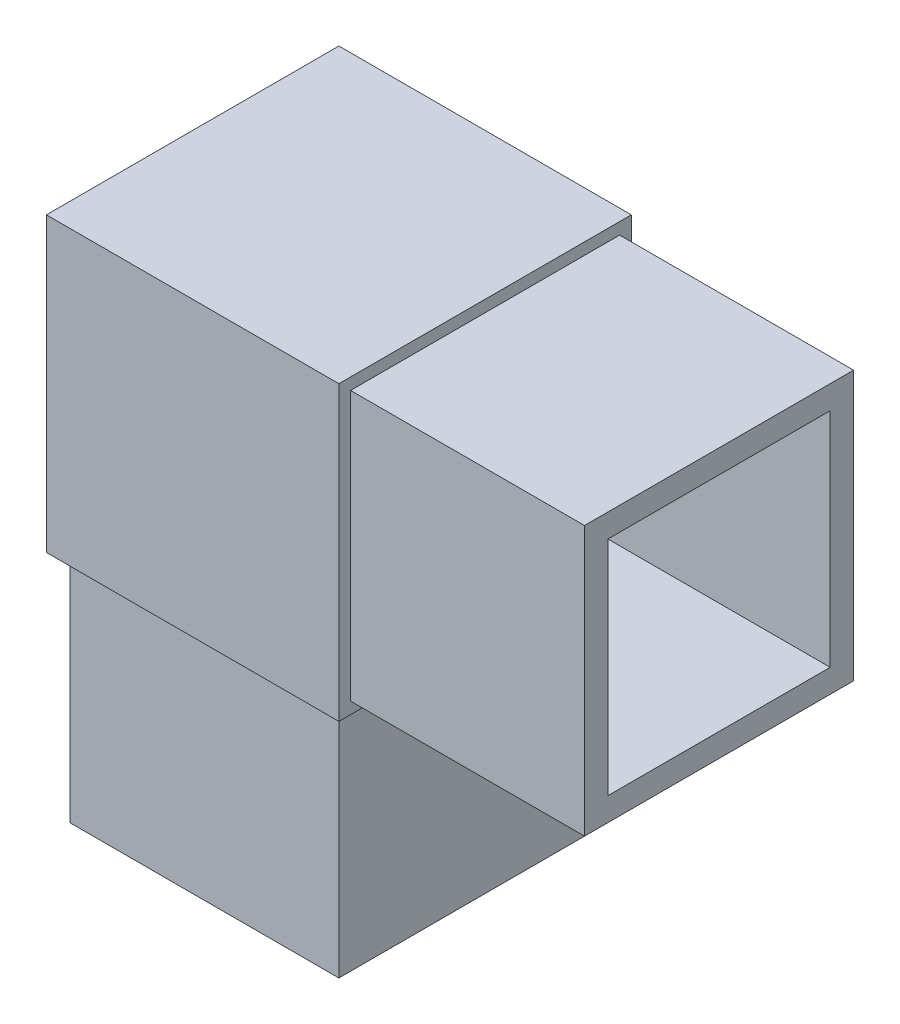
ISO-10303-21;
HEADER;
FILE_DESCRIPTION(('STEP AP214'),'2;1');
FILE_NAME('part.step','',(''),(''),'','','');
FILE_SCHEMA(('AUTOMOTIVE_DESIGN { 1 0 10303 214 1 1 1 1 }'));
ENDSEC;
DATA;
#1=APPLICATION_CONTEXT('core data for automotive mechanical design processes');
#2=APPLICATION_PROTOCOL_DEFINITION('international standard','automotive_design',2000,#1);
#3=PRODUCT_CONTEXT('',#1,'mechanical');
#4=PRODUCT('Part','Part','',(#3));
#5=PRODUCT_RELATED_PRODUCT_CATEGORY('part','',(#4));
#6=PRODUCT_DEFINITION_FORMATION('','',#4);
#7=PRODUCT_DEFINITION_CONTEXT('part definition',#1,'design');
#8=PRODUCT_DEFINITION('design','',#6,#7);
#9=PRODUCT_DEFINITION_SHAPE('','',#8);
#10=(LENGTH_UNIT() NAMED_UNIT(*) SI_UNIT(.MILLI.,.METRE.));
#11=(NAMED_UNIT(*) PLANE_ANGLE_UNIT() SI_UNIT($,.RADIAN.));
#12=(NAMED_UNIT(*) SI_UNIT($,.STERADIAN.) SOLID_ANGLE_UNIT());
#13=UNCERTAINTY_MEASURE_WITH_UNIT(LENGTH_MEASURE(1.E-05),#10,'distance_accuracy_value','');
#14=(GEOMETRIC_REPRESENTATION_CONTEXT(3) GLOBAL_UNCERTAINTY_ASSIGNED_CONTEXT((#13)) GLOBAL_UNIT_ASSIGNED_CONTEXT((#10,
#11,#12)) REPRESENTATION_CONTEXT('',''));
#15=CARTESIAN_POINT('',(0.,0.,0.));
#16=DIRECTION('',(0.,0.,1.));
#17=DIRECTION('',(1.,0.,0.));
#18=AXIS2_PLACEMENT_3D('',#15,#16,#17);
#19=CARTESIAN_POINT('',(-45.1495420366021,-179.712052706335,25.));
#20=DIRECTION('',(-1.,0.,0.));
#21=DIRECTION('',(0.,0.,1.));
#22=AXIS2_PLACEMENT_3D('',#19,#20,#21);
#23=PLANE('',#22);
#24=DIRECTION('',(0.,1.,0.));
#25=VECTOR('',#24,1.);
#26=CARTESIAN_POINT('',(-45.1495420366021,-179.712052706335,0.));
#27=LINE('',#26,#25);
#28=CARTESIAN_POINT('',(-45.1495420366021,-159.712052706335,0.));
#29=VERTEX_POINT('',#28);
#30=CARTESIAN_POINT('',(-45.1495420366021,-134.712052706335,0.));
#31=VERTEX_POINT('',#30);
#32=EDGE_CURVE('E289',#29,#31,#27,.T.);
#33=ORIENTED_EDGE('',*,*,#32,.F.);
#34=DIRECTION('',(0.,0.,-1.));
#35=VECTOR('',#34,1.);
#36=CARTESIAN_POINT('',(-45.1495420366021,-159.712052706335,25.));
#37=LINE('',#36,#35);
#38=CARTESIAN_POINT('',(-45.1495420366021,-159.712052706335,25.));
#39=VERTEX_POINT('',#38);
#40=EDGE_CURVE('E235',#39,#29,#37,.T.);
#41=ORIENTED_EDGE('',*,*,#40,.F.);
#42=DIRECTION('',(0.,1.,0.));
#43=VECTOR('',#42,1.);
#44=CARTESIAN_POINT('',(-45.1495420366021,-179.712052706335,25.));
#45=LINE('',#44,#43);
#46=CARTESIAN_POINT('',(-45.1495420366021,-134.712052706335,25.));
#47=VERTEX_POINT('',#46);
#48=EDGE_CURVE('E292',#39,#47,#45,.T.);
#49=ORIENTED_EDGE('',*,*,#48,.T.);
#50=DIRECTION('',(0.,0.,-1.));
#51=VECTOR('',#50,1.);
#52=CARTESIAN_POINT('',(-45.1495420366021,-134.712052706335,25.));
#53=LINE('',#52,#51);
#54=EDGE_CURVE('E41',#47,#31,#53,.T.);
#55=ORIENTED_EDGE('',*,*,#54,.T.);
#56=EDGE_LOOP('',(#33,#41,#49,#55));
#57=FACE_BOUND('',#56,.T.);
#58=ADVANCED_FACE('F34',(#57),#23,.T.);
#59=CARTESIAN_POINT('',(0.,0.,25.));
#60=DIRECTION('',(0.,0.,-1.));
#61=DIRECTION('',(-1.,0.,0.));
#62=AXIS2_PLACEMENT_3D('',#59,#60,#61);
#63=PLANE('',#62);
#64=DIRECTION('',(-1.,0.,0.));
#65=VECTOR('',#64,1.);
#66=CARTESIAN_POINT('',(-45.1495420366021,-159.712052706335,25.));
#67=LINE('',#66,#65);
#68=CARTESIAN_POINT('',(-20.1495420366021,-159.712052706335,25.));
#69=VERTEX_POINT('',#68);
#70=EDGE_CURVE('E247',#69,#39,#67,.T.);
#71=ORIENTED_EDGE('',*,*,#70,.F.);
#72=DIRECTION('',(0.,-1.,0.));
#73=VECTOR('',#72,1.);
#74=CARTESIAN_POINT('',(-20.1495420366021,-179.712052706335,25.));
#75=LINE('',#74,#73);
#76=CARTESIAN_POINT('',(-20.1495420366021,-134.712052706335,25.));
#77=VERTEX_POINT('',#76);
#78=EDGE_CURVE('E276',#77,#69,#75,.T.);
#79=ORIENTED_EDGE('',*,*,#78,.F.);
#80=DIRECTION('',(1.,0.,0.));
#81=VECTOR('',#80,1.);
#82=CARTESIAN_POINT('',(-45.1495420366021,-134.712052706335,25.));
#83=LINE('',#82,#81);
#84=EDGE_CURVE('E294',#47,#77,#83,.T.);
#85=ORIENTED_EDGE('',*,*,#84,.F.);
#86=ORIENTED_EDGE('',*,*,#48,.F.);
#87=EDGE_LOOP('',(#71,#79,#85,#86));
#88=FACE_BOUND('',#87,.T.);
#89=ADVANCED_FACE('F321',(#88),#63,.F.);
#90=CARTESIAN_POINT('',(0.,0.,0.));
#91=DIRECTION('',(0.,0.,-1.));
#92=DIRECTION('',(-1.,0.,0.));
#93=AXIS2_PLACEMENT_3D('',#90,#91,#92);
#94=PLANE('',#93);
#95=DIRECTION('',(0.,-1.,0.));
#96=VECTOR('',#95,1.);
#97=CARTESIAN_POINT('',(-20.1495420366021,-179.712052706335,0.));
#98=LINE('',#97,#96);
#99=CARTESIAN_POINT('',(-20.1495420366021,-134.712052706335,0.));
#100=VERTEX_POINT('',#99);
#101=CARTESIAN_POINT('',(-20.1495420366021,-159.712052706335,0.));
#102=VERTEX_POINT('',#101);
#103=EDGE_CURVE('E286',#100,#102,#98,.T.);
#104=ORIENTED_EDGE('',*,*,#103,.T.);
#105=DIRECTION('',(1.,0.,0.));
#106=VECTOR('',#105,1.);
#107=CARTESIAN_POINT('',(-45.1495420366021,-159.712052706335,0.));
#108=LINE('',#107,#106);
#109=EDGE_CURVE('E243',#29,#102,#108,.T.);
#110=ORIENTED_EDGE('',*,*,#109,.F.);
#111=ORIENTED_EDGE('',*,*,#32,.T.);
#112=DIRECTION('',(1.,0.,0.));
#113=VECTOR('',#112,1.);
#114=CARTESIAN_POINT('',(-45.1495420366021,-134.712052706335,0.));
#115=LINE('',#114,#113);
#116=EDGE_CURVE('E295',#31,#100,#115,.T.);
#117=ORIENTED_EDGE('',*,*,#116,.T.);
#118=EDGE_LOOP('',(#104,#110,#111,#117));
#119=FACE_BOUND('',#118,.T.);
#120=ADVANCED_FACE('F312',(#119),#94,.T.);
#121=CARTESIAN_POINT('',(-20.1495420366021,-179.712052706335,0.));
#122=DIRECTION('',(-1.,0.,0.));
#123=DIRECTION('',(0.,0.,1.));
#124=AXIS2_PLACEMENT_3D('',#121,#122,#123);
#125=PLANE('',#124);
#126=DIRECTION('',(0.,0.,1.));
#127=VECTOR('',#126,1.);
#128=CARTESIAN_POINT('',(-20.1495420366021,-135.712052706335,24.));
#129=LINE('',#128,#127);
#130=CARTESIAN_POINT('',(-20.1495420366021,-135.712052706335,1.));
#131=VERTEX_POINT('',#130);
#132=CARTESIAN_POINT('',(-20.1495420366021,-135.712052706335,24.));
#133=VERTEX_POINT('',#132);
#134=EDGE_CURVE('E262',#131,#133,#129,.T.);
#135=ORIENTED_EDGE('',*,*,#134,.F.);
#136=DIRECTION('',(0.,1.,0.));
#137=VECTOR('',#136,1.);
#138=CARTESIAN_POINT('',(-20.1495420366021,-158.712052706335,1.));
#139=LINE('',#138,#137);
#140=CARTESIAN_POINT('',(-20.1495420366021,-158.712052706335,1.));
#141=VERTEX_POINT('',#140);
#142=EDGE_CURVE('E273',#141,#131,#139,.T.);
#143=ORIENTED_EDGE('',*,*,#142,.F.);
#144=DIRECTION('',(0.,0.,-1.));
#145=VECTOR('',#144,1.);
#146=CARTESIAN_POINT('',(-20.1495420366021,-158.712052706335,24.));
#147=LINE('',#146,#145);
#148=CARTESIAN_POINT('',(-20.1495420366021,-158.712052706335,24.));
#149=VERTEX_POINT('',#148);
#150=EDGE_CURVE('E270',#149,#141,#147,.T.);
#151=ORIENTED_EDGE('',*,*,#150,.F.);
#152=DIRECTION('',(0.,-1.,0.));
#153=VECTOR('',#152,1.);
#154=CARTESIAN_POINT('',(-20.1495420366021,-158.712052706335,24.));
#155=LINE('',#154,#153);
#156=EDGE_CURVE('E267',#133,#149,#155,.T.);
#157=ORIENTED_EDGE('',*,*,#156,.F.);
#158=EDGE_LOOP('',(#135,#143,#151,#157));
#159=FACE_BOUND('',#158,.T.);
#160=DIRECTION('',(0.,0.,1.));
#161=VECTOR('',#160,1.);
#162=CARTESIAN_POINT('',(-20.1495420366021,-159.712052706335,25.));
#163=LINE('',#162,#161);
#164=EDGE_CURVE('E245',#102,#69,#163,.T.);
#165=ORIENTED_EDGE('',*,*,#164,.F.);
#166=ORIENTED_EDGE('',*,*,#103,.F.);
#167=DIRECTION('',(0.,0.,1.));
#168=VECTOR('',#167,1.);
#169=CARTESIAN_POINT('',(-20.1495420366021,-134.712052706335,25.));
#170=LINE('',#169,#168);
#171=EDGE_CURVE('E249',#100,#77,#170,.T.);
#172=ORIENTED_EDGE('',*,*,#171,.T.);
#173=ORIENTED_EDGE('',*,*,#78,.T.);
#174=EDGE_LOOP('',(#165,#166,#172,#173));
#175=FACE_BOUND('',#174,.T.);
#176=ADVANCED_FACE('F319',(#159,#175),#125,.F.);
#177=CARTESIAN_POINT('',(-45.1495420366021,-134.712052706335,25.));
#178=DIRECTION('',(0.,1.,0.));
#179=DIRECTION('',(0.,0.,1.));
#180=AXIS2_PLACEMENT_3D('',#177,#178,#179);
#181=PLANE('',#180);
#182=ORIENTED_EDGE('',*,*,#171,.F.);
#183=ORIENTED_EDGE('',*,*,#116,.F.);
#184=ORIENTED_EDGE('',*,*,#54,.F.);
#185=ORIENTED_EDGE('',*,*,#84,.T.);
#186=EDGE_LOOP('',(#182,#183,#184,#185));
#187=FACE_BOUND('',#186,.T.);
#188=ADVANCED_FACE('F310',(#187),#181,.T.);
#189=CARTESIAN_POINT('',(-55.5048810959294,-158.712052706335,24.));
#190=DIRECTION('',(0.,0.,1.));
#191=DIRECTION('',(1.,0.,0.));
#192=AXIS2_PLACEMENT_3D('',#189,#190,#191);
#193=PLANE('',#192);
#194=ORIENTED_EDGE('',*,*,#156,.T.);
#195=DIRECTION('',(1.,0.,0.));
#196=VECTOR('',#195,1.);
#197=CARTESIAN_POINT('',(-55.5048810959294,-158.712052706335,24.));
#198=LINE('',#197,#196);
#199=CARTESIAN_POINT('',(-0.149542036602078,-158.712052706335,24.));
#200=VERTEX_POINT('',#199);
#201=EDGE_CURVE('E258',#149,#200,#198,.T.);
#202=ORIENTED_EDGE('',*,*,#201,.T.);
#203=DIRECTION('',(0.,-1.,0.));
#204=VECTOR('',#203,1.);
#205=CARTESIAN_POINT('',(-0.149542036602078,-158.712052706335,24.));
#206=LINE('',#205,#204);
#207=CARTESIAN_POINT('',(-0.149542036602078,-135.712052706335,24.));
#208=VERTEX_POINT('',#207);
#209=EDGE_CURVE('E263',#208,#200,#206,.T.);
#210=ORIENTED_EDGE('',*,*,#209,.F.);
#211=DIRECTION('',(1.,0.,0.));
#212=VECTOR('',#211,1.);
#213=CARTESIAN_POINT('',(-55.5048810959294,-135.712052706335,24.));
#214=LINE('',#213,#212);
#215=EDGE_CURVE('E266',#133,#208,#214,.T.);
#216=ORIENTED_EDGE('',*,*,#215,.F.);
#217=EDGE_LOOP('',(#194,#202,#210,#216));
#218=FACE_BOUND('',#217,.T.);
#219=ADVANCED_FACE('F340',(#218),#193,.T.);
#220=CARTESIAN_POINT('',(-55.5048810959294,-135.712052706335,24.));
#221=DIRECTION('',(0.,1.,0.));
#222=DIRECTION('',(0.,0.,1.));
#223=AXIS2_PLACEMENT_3D('',#220,#221,#222);
#224=PLANE('',#223);
#225=ORIENTED_EDGE('',*,*,#134,.T.);
#226=ORIENTED_EDGE('',*,*,#215,.T.);
#227=DIRECTION('',(0.,0.,1.));
#228=VECTOR('',#227,1.);
#229=CARTESIAN_POINT('',(-0.149542036602078,-135.712052706335,24.));
#230=LINE('',#229,#228);
#231=CARTESIAN_POINT('',(-0.149542036602078,-135.712052706335,1.));
#232=VERTEX_POINT('',#231);
#233=EDGE_CURVE('E250',#232,#208,#230,.T.);
#234=ORIENTED_EDGE('',*,*,#233,.F.);
#235=DIRECTION('',(1.,0.,0.));
#236=VECTOR('',#235,1.);
#237=CARTESIAN_POINT('',(-55.5048810959294,-135.712052706335,1.));
#238=LINE('',#237,#236);
#239=EDGE_CURVE('E254',#131,#232,#238,.T.);
#240=ORIENTED_EDGE('',*,*,#239,.F.);
#241=EDGE_LOOP('',(#225,#226,#234,#240));
#242=FACE_BOUND('',#241,.T.);
#243=ADVANCED_FACE('F345',(#242),#224,.T.);
#244=CARTESIAN_POINT('',(-55.5048810959294,-158.712052706335,1.));
#245=DIRECTION('',(0.,0.,-1.));
#246=DIRECTION('',(-1.,0.,0.));
#247=AXIS2_PLACEMENT_3D('',#244,#245,#246);
#248=PLANE('',#247);
#249=ORIENTED_EDGE('',*,*,#142,.T.);
#250=ORIENTED_EDGE('',*,*,#239,.T.);
#251=DIRECTION('',(0.,1.,0.));
#252=VECTOR('',#251,1.);
#253=CARTESIAN_POINT('',(-0.149542036602078,-158.712052706335,1.));
#254=LINE('',#253,#252);
#255=CARTESIAN_POINT('',(-0.149542036602078,-158.712052706335,1.));
#256=VERTEX_POINT('',#255);
#257=EDGE_CURVE('E255',#256,#232,#254,.T.);
#258=ORIENTED_EDGE('',*,*,#257,.F.);
#259=DIRECTION('',(1.,0.,0.));
#260=VECTOR('',#259,1.);
#261=CARTESIAN_POINT('',(-55.5048810959294,-158.712052706335,1.));
#262=LINE('',#261,#260);
#263=EDGE_CURVE('E253',#141,#256,#262,.T.);
#264=ORIENTED_EDGE('',*,*,#263,.F.);
#265=EDGE_LOOP('',(#249,#250,#258,#264));
#266=FACE_BOUND('',#265,.T.);
#267=ADVANCED_FACE('F357',(#266),#248,.T.);
#268=CARTESIAN_POINT('',(-55.5048810959294,-158.712052706335,24.));
#269=DIRECTION('',(0.,-1.,0.));
#270=DIRECTION('',(0.,0.,-1.));
#271=AXIS2_PLACEMENT_3D('',#268,#269,#270);
#272=PLANE('',#271);
#273=ORIENTED_EDGE('',*,*,#150,.T.);
#274=ORIENTED_EDGE('',*,*,#263,.T.);
#275=DIRECTION('',(0.,0.,-1.));
#276=VECTOR('',#275,1.);
#277=CARTESIAN_POINT('',(-0.149542036602078,-158.712052706335,24.));
#278=LINE('',#277,#276);
#279=EDGE_CURVE('E259',#200,#256,#278,.T.);
#280=ORIENTED_EDGE('',*,*,#279,.F.);
#281=ORIENTED_EDGE('',*,*,#201,.F.);
#282=EDGE_LOOP('',(#273,#274,#280,#281));
#283=FACE_BOUND('',#282,.T.);
#284=ADVANCED_FACE('F337',(#283),#272,.T.);
#285=CARTESIAN_POINT('',(-0.149542036602078,-179.712052706335,25.));
#286=DIRECTION('',(-1.,0.,0.));
#287=DIRECTION('',(0.,0.,1.));
#288=AXIS2_PLACEMENT_3D('',#285,#286,#287);
#289=PLANE('',#288);
#290=DIRECTION('',(0.,0.,-1.));
#291=VECTOR('',#290,1.);
#292=CARTESIAN_POINT('',(-0.149542036602078,-156.712052706335,22.));
#293=LINE('',#292,#291);
#294=CARTESIAN_POINT('',(-0.149542036602078,-156.712052706335,22.));
#295=VERTEX_POINT('',#294);
#296=CARTESIAN_POINT('',(-0.149542036602078,-156.712052706335,3.));
#297=VERTEX_POINT('',#296);
#298=EDGE_CURVE('E194',#295,#297,#293,.T.);
#299=ORIENTED_EDGE('',*,*,#298,.F.);
#300=DIRECTION('',(0.,-1.,0.));
#301=VECTOR('',#300,1.);
#302=CARTESIAN_POINT('',(-0.149542036602078,-156.712052706335,22.));
#303=LINE('',#302,#301);
#304=CARTESIAN_POINT('',(-0.149542036602078,-137.712052706335,22.));
#305=VERTEX_POINT('',#304);
#306=EDGE_CURVE('E166',#305,#295,#303,.T.);
#307=ORIENTED_EDGE('',*,*,#306,.F.);
#308=DIRECTION('',(0.,0.,1.));
#309=VECTOR('',#308,1.);
#310=CARTESIAN_POINT('',(-0.149542036602078,-137.712052706335,22.));
#311=LINE('',#310,#309);
#312=CARTESIAN_POINT('',(-0.149542036602078,-137.712052706335,3.));
#313=VERTEX_POINT('',#312);
#314=EDGE_CURVE('E188',#313,#305,#311,.T.);
#315=ORIENTED_EDGE('',*,*,#314,.F.);
#316=DIRECTION('',(0.,1.,0.));
#317=VECTOR('',#316,1.);
#318=CARTESIAN_POINT('',(-0.149542036602078,-156.712052706335,3.));
#319=LINE('',#318,#317);
#320=EDGE_CURVE('E196',#297,#313,#319,.T.);
#321=ORIENTED_EDGE('',*,*,#320,.F.);
#322=EDGE_LOOP('',(#299,#307,#315,#321));
#323=FACE_BOUND('',#322,.T.);
#324=ORIENTED_EDGE('',*,*,#209,.T.);
#325=ORIENTED_EDGE('',*,*,#279,.T.);
#326=ORIENTED_EDGE('',*,*,#257,.T.);
#327=ORIENTED_EDGE('',*,*,#233,.T.);
#328=EDGE_LOOP('',(#324,#325,#326,#327));
#329=FACE_BOUND('',#328,.T.);
#330=ADVANCED_FACE('F335',(#323,#329),#289,.F.);
#331=CARTESIAN_POINT('',(1.87184647332499E-13,-159.712052706335,0.));
#332=DIRECTION('',(0.,-1.,0.));
#333=DIRECTION('',(1.,0.,0.));
#334=AXIS2_PLACEMENT_3D('',#331,#332,#333);
#335=PLANE('',#334);
#336=DIRECTION('',(-1.,0.,0.));
#337=VECTOR('',#336,1.);
#338=CARTESIAN_POINT('',(-44.1495420366021,-159.712052706335,24.));
#339=LINE('',#338,#337);
#340=CARTESIAN_POINT('',(-21.1495420366021,-159.712052706335,24.));
#341=VERTEX_POINT('',#340);
#342=CARTESIAN_POINT('',(-44.1495420366021,-159.712052706335,24.));
#343=VERTEX_POINT('',#342);
#344=EDGE_CURVE('E219',#341,#343,#339,.T.);
#345=ORIENTED_EDGE('',*,*,#344,.F.);
#346=DIRECTION('',(0.,0.,1.));
#347=VECTOR('',#346,1.);
#348=CARTESIAN_POINT('',(-21.1495420366021,-159.712052706335,24.));
#349=LINE('',#348,#347);
#350=CARTESIAN_POINT('',(-21.1495420366021,-159.712052706335,1.));
#351=VERTEX_POINT('',#350);
#352=EDGE_CURVE('E216',#351,#341,#349,.T.);
#353=ORIENTED_EDGE('',*,*,#352,.F.);
#354=DIRECTION('',(1.,0.,0.));
#355=VECTOR('',#354,1.);
#356=CARTESIAN_POINT('',(-44.1495420366021,-159.712052706335,1.));
#357=LINE('',#356,#355);
#358=CARTESIAN_POINT('',(-44.1495420366021,-159.712052706335,1.));
#359=VERTEX_POINT('',#358);
#360=EDGE_CURVE('E212',#359,#351,#357,.T.);
#361=ORIENTED_EDGE('',*,*,#360,.F.);
#362=DIRECTION('',(0.,0.,-1.));
#363=VECTOR('',#362,1.);
#364=CARTESIAN_POINT('',(-44.1495420366021,-159.712052706335,24.));
#365=LINE('',#364,#363);
#366=EDGE_CURVE('E209',#343,#359,#365,.T.);
#367=ORIENTED_EDGE('',*,*,#366,.F.);
#368=EDGE_LOOP('',(#345,#353,#361,#367));
#369=FACE_BOUND('',#368,.T.);
#370=ORIENTED_EDGE('',*,*,#40,.T.);
#371=ORIENTED_EDGE('',*,*,#109,.T.);
#372=ORIENTED_EDGE('',*,*,#164,.T.);
#373=ORIENTED_EDGE('',*,*,#70,.T.);
#374=EDGE_LOOP('',(#370,#371,#372,#373));
#375=FACE_BOUND('',#374,.T.);
#376=ADVANCED_FACE('F316',(#369,#375),#335,.T.);
#377=CARTESIAN_POINT('',(-44.1495420366021,-159.712052706335,24.));
#378=DIRECTION('',(-1.,0.,0.));
#379=DIRECTION('',(0.,-1.,0.));
#380=AXIS2_PLACEMENT_3D('',#377,#378,#379);
#381=PLANE('',#380);
#382=DIRECTION('',(0.,0.,-1.));
#383=VECTOR('',#382,1.);
#384=CARTESIAN_POINT('',(-44.1495420366021,-179.712052706335,24.));
#385=LINE('',#384,#383);
#386=CARTESIAN_POINT('',(-44.1495420366021,-179.712052706335,24.));
#387=VERTEX_POINT('',#386);
#388=CARTESIAN_POINT('',(-44.1495420366021,-179.712052706335,1.));
#389=VERTEX_POINT('',#388);
#390=EDGE_CURVE('E203',#387,#389,#385,.T.);
#391=ORIENTED_EDGE('',*,*,#390,.F.);
#392=DIRECTION('',(0.,-1.,0.));
#393=VECTOR('',#392,1.);
#394=CARTESIAN_POINT('',(-44.1495420366021,-159.712052706335,24.));
#395=LINE('',#394,#393);
#396=EDGE_CURVE('E233',#343,#387,#395,.T.);
#397=ORIENTED_EDGE('',*,*,#396,.F.);
#398=ORIENTED_EDGE('',*,*,#366,.T.);
#399=DIRECTION('',(0.,-1.,0.));
#400=VECTOR('',#399,1.);
#401=CARTESIAN_POINT('',(-44.1495420366021,-159.712052706335,1.));
#402=LINE('',#401,#400);
#403=EDGE_CURVE('E222',#359,#389,#402,.T.);
#404=ORIENTED_EDGE('',*,*,#403,.T.);
#405=EDGE_LOOP('',(#391,#397,#398,#404));
#406=FACE_BOUND('',#405,.T.);
#407=ADVANCED_FACE('F415',(#406),#381,.T.);
#408=CARTESIAN_POINT('',(-44.1495420366021,-159.712052706335,24.));
#409=DIRECTION('',(0.,0.,1.));
#410=DIRECTION('',(1.,0.,0.));
#411=AXIS2_PLACEMENT_3D('',#408,#409,#410);
#412=PLANE('',#411);
#413=DIRECTION('',(-1.,0.,0.));
#414=VECTOR('',#413,1.);
#415=CARTESIAN_POINT('',(-44.1495420366021,-179.712052706335,24.));
#416=LINE('',#415,#414);
#417=CARTESIAN_POINT('',(-21.1495420366021,-179.712052706335,24.));
#418=VERTEX_POINT('',#417);
#419=EDGE_CURVE('E213',#418,#387,#416,.T.);
#420=ORIENTED_EDGE('',*,*,#419,.F.);
#421=DIRECTION('',(0.,-1.,0.));
#422=VECTOR('',#421,1.);
#423=CARTESIAN_POINT('',(-21.1495420366021,-159.712052706335,24.));
#424=LINE('',#423,#422);
#425=EDGE_CURVE('E236',#341,#418,#424,.T.);
#426=ORIENTED_EDGE('',*,*,#425,.F.);
#427=ORIENTED_EDGE('',*,*,#344,.T.);
#428=ORIENTED_EDGE('',*,*,#396,.T.);
#429=EDGE_LOOP('',(#420,#426,#427,#428));
#430=FACE_BOUND('',#429,.T.);
#431=ADVANCED_FACE('F424',(#430),#412,.T.);
#432=CARTESIAN_POINT('',(-21.1495420366021,-159.712052706335,24.));
#433=DIRECTION('',(1.,0.,0.));
#434=DIRECTION('',(0.,1.,0.));
#435=AXIS2_PLACEMENT_3D('',#432,#433,#434);
#436=PLANE('',#435);
#437=DIRECTION('',(0.,0.,1.));
#438=VECTOR('',#437,1.);
#439=CARTESIAN_POINT('',(-21.1495420366021,-179.712052706335,24.));
#440=LINE('',#439,#438);
#441=CARTESIAN_POINT('',(-21.1495420366021,-179.712052706335,1.));
#442=VERTEX_POINT('',#441);
#443=EDGE_CURVE('E228',#442,#418,#440,.T.);
#444=ORIENTED_EDGE('',*,*,#443,.F.);
#445=DIRECTION('',(0.,-1.,0.));
#446=VECTOR('',#445,1.);
#447=CARTESIAN_POINT('',(-21.1495420366021,-159.712052706335,1.));
#448=LINE('',#447,#446);
#449=EDGE_CURVE('E238',#351,#442,#448,.T.);
#450=ORIENTED_EDGE('',*,*,#449,.F.);
#451=ORIENTED_EDGE('',*,*,#352,.T.);
#452=ORIENTED_EDGE('',*,*,#425,.T.);
#453=EDGE_LOOP('',(#444,#450,#451,#452));
#454=FACE_BOUND('',#453,.T.);
#455=ADVANCED_FACE('F433',(#454),#436,.T.);
#456=CARTESIAN_POINT('',(-44.1495420366021,-159.712052706335,1.));
#457=DIRECTION('',(0.,0.,-1.));
#458=DIRECTION('',(-1.,0.,0.));
#459=AXIS2_PLACEMENT_3D('',#456,#457,#458);
#460=PLANE('',#459);
#461=DIRECTION('',(1.,0.,0.));
#462=VECTOR('',#461,1.);
#463=CARTESIAN_POINT('',(-44.1495420366021,-179.712052706335,1.));
#464=LINE('',#463,#462);
#465=EDGE_CURVE('E225',#389,#442,#464,.T.);
#466=ORIENTED_EDGE('',*,*,#465,.F.);
#467=ORIENTED_EDGE('',*,*,#403,.F.);
#468=ORIENTED_EDGE('',*,*,#360,.T.);
#469=ORIENTED_EDGE('',*,*,#449,.T.);
#470=EDGE_LOOP('',(#466,#467,#468,#469));
#471=FACE_BOUND('',#470,.T.);
#472=ADVANCED_FACE('F334',(#471),#460,.T.);
#473=CARTESIAN_POINT('',(-45.1495420366021,-179.712052706335,25.));
#474=DIRECTION('',(0.,1.,0.));
#475=DIRECTION('',(-1.,0.,0.));
#476=AXIS2_PLACEMENT_3D('',#473,#474,#475);
#477=PLANE('',#476);
#478=DIRECTION('',(0.,0.,1.));
#479=VECTOR('',#478,1.);
#480=CARTESIAN_POINT('',(-23.1495420366021,-179.712052706335,22.));
#481=LINE('',#480,#479);
#482=CARTESIAN_POINT('',(-23.1495420366021,-179.712052706335,3.));
#483=VERTEX_POINT('',#482);
#484=CARTESIAN_POINT('',(-23.1495420366021,-179.712052706335,22.));
#485=VERTEX_POINT('',#484);
#486=EDGE_CURVE('E170',#483,#485,#481,.T.);
#487=ORIENTED_EDGE('',*,*,#486,.F.);
#488=DIRECTION('',(1.,0.,0.));
#489=VECTOR('',#488,1.);
#490=CARTESIAN_POINT('',(-42.1495420366021,-179.712052706335,3.));
#491=LINE('',#490,#489);
#492=CARTESIAN_POINT('',(-42.1495420366021,-179.712052706335,3.));
#493=VERTEX_POINT('',#492);
#494=EDGE_CURVE('E176',#493,#483,#491,.T.);
#495=ORIENTED_EDGE('',*,*,#494,.F.);
#496=DIRECTION('',(0.,0.,-1.));
#497=VECTOR('',#496,1.);
#498=CARTESIAN_POINT('',(-42.1495420366021,-179.712052706335,22.));
#499=LINE('',#498,#497);
#500=CARTESIAN_POINT('',(-42.1495420366021,-179.712052706335,22.));
#501=VERTEX_POINT('',#500);
#502=EDGE_CURVE('E180',#501,#493,#499,.T.);
#503=ORIENTED_EDGE('',*,*,#502,.F.);
#504=DIRECTION('',(-1.,0.,0.));
#505=VECTOR('',#504,1.);
#506=CARTESIAN_POINT('',(-42.1495420366021,-179.712052706335,22.));
#507=LINE('',#506,#505);
#508=EDGE_CURVE('E163',#485,#501,#507,.T.);
#509=ORIENTED_EDGE('',*,*,#508,.F.);
#510=EDGE_LOOP('',(#487,#495,#503,#509));
#511=FACE_BOUND('',#510,.T.);
#512=ORIENTED_EDGE('',*,*,#390,.T.);
#513=ORIENTED_EDGE('',*,*,#465,.T.);
#514=ORIENTED_EDGE('',*,*,#443,.T.);
#515=ORIENTED_EDGE('',*,*,#419,.T.);
#516=EDGE_LOOP('',(#512,#513,#514,#515));
#517=FACE_BOUND('',#516,.T.);
#518=ADVANCED_FACE('F178',(#511,#517),#477,.F.);
#519=CARTESIAN_POINT('',(-42.1495420366021,-156.712052706335,22.));
#520=DIRECTION('',(0.,0.,1.));
#521=DIRECTION('',(1.,0.,0.));
#522=AXIS2_PLACEMENT_3D('',#519,#520,#521);
#523=PLANE('',#522);
#524=DIRECTION('',(1.,0.,0.));
#525=VECTOR('',#524,1.);
#526=CARTESIAN_POINT('',(-42.1495420366021,-156.712052706335,22.));
#527=LINE('',#526,#525);
#528=CARTESIAN_POINT('',(-23.1495420366021,-156.712052706335,22.));
#529=VERTEX_POINT('',#528);
#530=EDGE_CURVE('E55',#529,#295,#527,.T.);
#531=ORIENTED_EDGE('',*,*,#530,.F.);
#532=DIRECTION('',(0.,-1.,0.));
#533=VECTOR('',#532,1.);
#534=CARTESIAN_POINT('',(-23.1495420366021,-110.841995021246,22.));
#535=LINE('',#534,#533);
#536=EDGE_CURVE('E159',#529,#485,#535,.T.);
#537=ORIENTED_EDGE('',*,*,#536,.T.);
#538=ORIENTED_EDGE('',*,*,#508,.T.);
#539=DIRECTION('',(0.,-1.,0.));
#540=VECTOR('',#539,1.);
#541=CARTESIAN_POINT('',(-42.1495420366021,-156.712052706335,22.));
#542=LINE('',#541,#540);
#543=CARTESIAN_POINT('',(-42.1495420366021,-137.712052706335,22.));
#544=VERTEX_POINT('',#543);
#545=EDGE_CURVE('E48',#544,#501,#542,.T.);
#546=ORIENTED_EDGE('',*,*,#545,.F.);
#547=DIRECTION('',(1.,0.,0.));
#548=VECTOR('',#547,1.);
#549=CARTESIAN_POINT('',(-42.1495420366021,-137.712052706335,22.));
#550=LINE('',#549,#548);
#551=EDGE_CURVE('E201',#544,#305,#550,.T.);
#552=ORIENTED_EDGE('',*,*,#551,.T.);
#553=ORIENTED_EDGE('',*,*,#306,.T.);
#554=EDGE_LOOP('',(#531,#537,#538,#546,#552,#553));
#555=FACE_BOUND('',#554,.T.);
#556=ADVANCED_FACE('F161',(#555),#523,.F.);
#557=CARTESIAN_POINT('',(-42.1495420366021,-137.712052706335,22.));
#558=DIRECTION('',(0.,1.,0.));
#559=DIRECTION('',(0.,0.,1.));
#560=AXIS2_PLACEMENT_3D('',#557,#558,#559);
#561=PLANE('',#560);
#562=ORIENTED_EDGE('',*,*,#314,.T.);
#563=ORIENTED_EDGE('',*,*,#551,.F.);
#564=DIRECTION('',(0.,0.,1.));
#565=VECTOR('',#564,1.);
#566=CARTESIAN_POINT('',(-42.1495420366021,-137.712052706335,22.));
#567=LINE('',#566,#565);
#568=CARTESIAN_POINT('',(-42.1495420366021,-137.712052706335,3.));
#569=VERTEX_POINT('',#568);
#570=EDGE_CURVE('E191',#569,#544,#567,.T.);
#571=ORIENTED_EDGE('',*,*,#570,.F.);
#572=DIRECTION('',(1.,0.,0.));
#573=VECTOR('',#572,1.);
#574=CARTESIAN_POINT('',(-42.1495420366021,-137.712052706335,3.));
#575=LINE('',#574,#573);
#576=EDGE_CURVE('E204',#569,#313,#575,.T.);
#577=ORIENTED_EDGE('',*,*,#576,.T.);
#578=EDGE_LOOP('',(#562,#563,#571,#577));
#579=FACE_BOUND('',#578,.T.);
#580=ADVANCED_FACE('F475',(#579),#561,.F.);
#581=CARTESIAN_POINT('',(-42.1495420366021,-156.712052706335,3.));
#582=DIRECTION('',(0.,0.,-1.));
#583=DIRECTION('',(-1.,0.,0.));
#584=AXIS2_PLACEMENT_3D('',#581,#582,#583);
#585=PLANE('',#584);
#586=ORIENTED_EDGE('',*,*,#320,.T.);
#587=ORIENTED_EDGE('',*,*,#576,.F.);
#588=DIRECTION('',(0.,1.,0.));
#589=VECTOR('',#588,1.);
#590=CARTESIAN_POINT('',(-42.1495420366021,-156.712052706335,3.));
#591=LINE('',#590,#589);
#592=EDGE_CURVE('E187',#493,#569,#591,.T.);
#593=ORIENTED_EDGE('',*,*,#592,.F.);
#594=ORIENTED_EDGE('',*,*,#494,.T.);
#595=DIRECTION('',(0.,-1.,0.));
#596=VECTOR('',#595,1.);
#597=CARTESIAN_POINT('',(-23.1495420366021,-110.841995021246,3.));
#598=LINE('',#597,#596);
#599=CARTESIAN_POINT('',(-23.1495420366021,-156.712052706335,3.));
#600=VERTEX_POINT('',#599);
#601=EDGE_CURVE('E167',#600,#483,#598,.T.);
#602=ORIENTED_EDGE('',*,*,#601,.F.);
#603=DIRECTION('',(1.,0.,0.));
#604=VECTOR('',#603,1.);
#605=CARTESIAN_POINT('',(-42.1495420366021,-156.712052706335,3.));
#606=LINE('',#605,#604);
#607=EDGE_CURVE('E206',#600,#297,#606,.T.);
#608=ORIENTED_EDGE('',*,*,#607,.T.);
#609=EDGE_LOOP('',(#586,#587,#593,#594,#602,#608));
#610=FACE_BOUND('',#609,.T.);
#611=ADVANCED_FACE('F486',(#610),#585,.F.);
#612=CARTESIAN_POINT('',(-42.1495420366021,-156.712052706335,22.));
#613=DIRECTION('',(0.,-1.,0.));
#614=DIRECTION('',(0.,0.,-1.));
#615=AXIS2_PLACEMENT_3D('',#612,#613,#614);
#616=PLANE('',#615);
#617=ORIENTED_EDGE('',*,*,#607,.F.);
#618=DIRECTION('',(0.,0.,1.));
#619=VECTOR('',#618,1.);
#620=CARTESIAN_POINT('',(-23.1495420366021,-156.712052706335,22.));
#621=LINE('',#620,#619);
#622=EDGE_CURVE('E11',#600,#529,#621,.T.);
#623=ORIENTED_EDGE('',*,*,#622,.T.);
#624=ORIENTED_EDGE('',*,*,#530,.T.);
#625=ORIENTED_EDGE('',*,*,#298,.T.);
#626=EDGE_LOOP('',(#617,#623,#624,#625));
#627=FACE_BOUND('',#626,.T.);
#628=ADVANCED_FACE('F496',(#627),#616,.F.);
#629=CARTESIAN_POINT('',(-42.1495420366021,0.,0.));
#630=DIRECTION('',(-1.,0.,0.));
#631=DIRECTION('',(0.,0.,1.));
#632=AXIS2_PLACEMENT_3D('',#629,#630,#631);
#633=PLANE('',#632);
#634=ORIENTED_EDGE('',*,*,#545,.T.);
#635=ORIENTED_EDGE('',*,*,#502,.T.);
#636=ORIENTED_EDGE('',*,*,#592,.T.);
#637=ORIENTED_EDGE('',*,*,#570,.T.);
#638=EDGE_LOOP('',(#634,#635,#636,#637));
#639=FACE_BOUND('',#638,.T.);
#640=ADVANCED_FACE('F507',(#639),#633,.F.);
#641=CARTESIAN_POINT('',(-23.1495420366021,-110.841995021246,22.));
#642=DIRECTION('',(1.,0.,0.));
#643=DIRECTION('',(0.,1.,0.));
#644=AXIS2_PLACEMENT_3D('',#641,#642,#643);
#645=PLANE('',#644);
#646=ORIENTED_EDGE('',*,*,#601,.T.);
#647=ORIENTED_EDGE('',*,*,#486,.T.);
#648=ORIENTED_EDGE('',*,*,#536,.F.);
#649=ORIENTED_EDGE('',*,*,#622,.F.);
#650=EDGE_LOOP('',(#646,#647,#648,#649));
#651=FACE_BOUND('',#650,.T.);
#652=ADVANCED_FACE('F171',(#651),#645,.F.);
#653=CLOSED_SHELL('',(#58,#89,#120,#176,#188,#219,#243,#267,#284,#330,#376,#407,#431,#455,#472,
#518,#556,#580,#611,#628,#640,#652));
#654=MANIFOLD_SOLID_BREP('B2',#653);
#655=ADVANCED_BREP_SHAPE_REPRESENTATION('',(#18,#654),#14);
#656=SHAPE_DEFINITION_REPRESENTATION(#9,#655);
ENDSEC;
END-ISO-10303-21;
